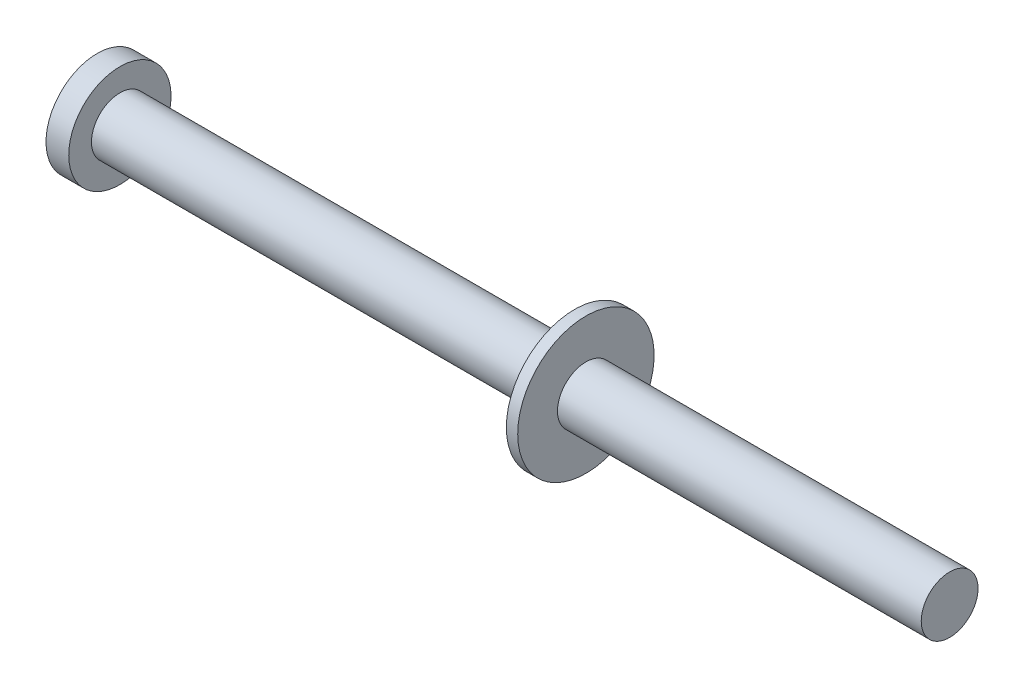
ISO-10303-21;
HEADER;
FILE_DESCRIPTION(('STEP AP214'),'2;1');
FILE_NAME('part.step','',(''),(''),'','','');
FILE_SCHEMA(('AUTOMOTIVE_DESIGN { 1 0 10303 214 1 1 1 1 }'));
ENDSEC;
DATA;
#1=APPLICATION_CONTEXT('core data for automotive mechanical design processes');
#2=APPLICATION_PROTOCOL_DEFINITION('international standard','automotive_design',2000,#1);
#3=PRODUCT_CONTEXT('',#1,'mechanical');
#4=PRODUCT('Part','Part','',(#3));
#5=PRODUCT_RELATED_PRODUCT_CATEGORY('part','',(#4));
#6=PRODUCT_DEFINITION_FORMATION('','',#4);
#7=PRODUCT_DEFINITION_CONTEXT('part definition',#1,'design');
#8=PRODUCT_DEFINITION('design','',#6,#7);
#9=PRODUCT_DEFINITION_SHAPE('','',#8);
#10=(LENGTH_UNIT() NAMED_UNIT(*) SI_UNIT(.MILLI.,.METRE.));
#11=(NAMED_UNIT(*) PLANE_ANGLE_UNIT() SI_UNIT($,.RADIAN.));
#12=(NAMED_UNIT(*) SI_UNIT($,.STERADIAN.) SOLID_ANGLE_UNIT());
#13=UNCERTAINTY_MEASURE_WITH_UNIT(LENGTH_MEASURE(1.E-05),#10,'distance_accuracy_value','');
#14=(GEOMETRIC_REPRESENTATION_CONTEXT(3) GLOBAL_UNCERTAINTY_ASSIGNED_CONTEXT((#13)) GLOBAL_UNIT_ASSIGNED_CONTEXT((#10,
#11,#12)) REPRESENTATION_CONTEXT('',''));
#15=CARTESIAN_POINT('',(0.,0.,0.));
#16=DIRECTION('',(0.,0.,1.));
#17=DIRECTION('',(1.,0.,0.));
#18=AXIS2_PLACEMENT_3D('',#15,#16,#17);
#19=CARTESIAN_POINT('',(-75.,0.,0.));
#20=DIRECTION('',(1.,0.,0.));
#21=DIRECTION('',(0.,0.,-1.));
#22=AXIS2_PLACEMENT_3D('',#19,#20,#21);
#23=PLANE('',#22);
#24=CARTESIAN_POINT('',(-75.,0.,0.));
#25=DIRECTION('',(-1.,0.,0.));
#26=DIRECTION('',(0.,0.,1.));
#27=AXIS2_PLACEMENT_3D('',#24,#25,#26);
#28=CIRCLE('',#27,9.);
#29=CARTESIAN_POINT('',(-75.,0.,9.));
#30=VERTEX_POINT('',#29);
#31=EDGE_CURVE('E10',#30,#30,#28,.T.);
#32=ORIENTED_EDGE('',*,*,#31,.T.);
#33=EDGE_LOOP('',(#32));
#34=FACE_BOUND('',#33,.T.);
#35=ADVANCED_FACE('F31',(#34),#23,.F.);
#36=CARTESIAN_POINT('',(-75.,0.,0.));
#37=DIRECTION('',(-1.,0.,0.));
#38=DIRECTION('',(0.,0.,1.));
#39=AXIS2_PLACEMENT_3D('',#36,#37,#38);
#40=CYLINDRICAL_SURFACE('',#39,9.);
#41=ORIENTED_EDGE('',*,*,#31,.F.);
#42=EDGE_LOOP('',(#41));
#43=FACE_BOUND('',#42,.T.);
#44=CARTESIAN_POINT('',(-71.,0.,0.));
#45=DIRECTION('',(-1.,0.,0.));
#46=DIRECTION('',(0.,0.,1.));
#47=AXIS2_PLACEMENT_3D('',#44,#45,#46);
#48=CIRCLE('',#47,9.);
#49=CARTESIAN_POINT('',(-71.,0.,9.));
#50=VERTEX_POINT('',#49);
#51=EDGE_CURVE('E37',#50,#50,#48,.T.);
#52=ORIENTED_EDGE('',*,*,#51,.T.);
#53=EDGE_LOOP('',(#52));
#54=FACE_BOUND('',#53,.T.);
#55=ADVANCED_FACE('F75',(#43,#54),#40,.T.);
#56=CARTESIAN_POINT('',(-71.,0.,-9.));
#57=DIRECTION('',(-1.,0.,0.));
#58=DIRECTION('',(0.,0.,1.));
#59=AXIS2_PLACEMENT_3D('',#56,#57,#58);
#60=PLANE('',#59);
#61=ORIENTED_EDGE('',*,*,#51,.F.);
#62=EDGE_LOOP('',(#61));
#63=FACE_BOUND('',#62,.T.);
#64=CARTESIAN_POINT('',(-71.,0.,0.));
#65=DIRECTION('',(-1.,0.,0.));
#66=DIRECTION('',(0.,0.,1.));
#67=AXIS2_PLACEMENT_3D('',#64,#65,#66);
#68=CIRCLE('',#67,5.);
#69=CARTESIAN_POINT('',(-71.,0.,5.));
#70=VERTEX_POINT('',#69);
#71=EDGE_CURVE('E41',#70,#70,#68,.T.);
#72=ORIENTED_EDGE('',*,*,#71,.T.);
#73=EDGE_LOOP('',(#72));
#74=FACE_BOUND('',#73,.T.);
#75=ADVANCED_FACE('F79',(#63,#74),#60,.F.);
#76=CARTESIAN_POINT('',(-75.,0.,0.));
#77=DIRECTION('',(-1.,0.,0.));
#78=DIRECTION('',(0.,0.,1.));
#79=AXIS2_PLACEMENT_3D('',#76,#77,#78);
#80=CYLINDRICAL_SURFACE('',#79,4.99999999999999);
#81=ORIENTED_EDGE('',*,*,#71,.F.);
#82=EDGE_LOOP('',(#81));
#83=FACE_BOUND('',#82,.T.);
#84=CARTESIAN_POINT('',(9.00000000000001,0.,0.));
#85=DIRECTION('',(-1.,0.,0.));
#86=DIRECTION('',(0.,0.,1.));
#87=AXIS2_PLACEMENT_3D('',#84,#85,#86);
#88=CIRCLE('',#87,4.99999999999998);
#89=CARTESIAN_POINT('',(9.00000000000001,0.,4.99999999999997));
#90=VERTEX_POINT('',#89);
#91=EDGE_CURVE('E45',#90,#90,#88,.T.);
#92=ORIENTED_EDGE('',*,*,#91,.T.);
#93=EDGE_LOOP('',(#92));
#94=FACE_BOUND('',#93,.T.);
#95=ADVANCED_FACE('F84',(#83,#94),#80,.T.);
#96=CARTESIAN_POINT('',(9.00000000000001,0.,-5.));
#97=DIRECTION('',(1.,0.,0.));
#98=DIRECTION('',(0.,0.,-1.));
#99=AXIS2_PLACEMENT_3D('',#96,#97,#98);
#100=PLANE('',#99);
#101=ORIENTED_EDGE('',*,*,#91,.F.);
#102=EDGE_LOOP('',(#101));
#103=FACE_BOUND('',#102,.T.);
#104=CARTESIAN_POINT('',(9.00000000000001,0.,0.));
#105=DIRECTION('',(-1.,0.,0.));
#106=DIRECTION('',(0.,0.,1.));
#107=AXIS2_PLACEMENT_3D('',#104,#105,#106);
#108=CIRCLE('',#107,12.);
#109=CARTESIAN_POINT('',(9.00000000000001,0.,12.));
#110=VERTEX_POINT('',#109);
#111=EDGE_CURVE('E50',#110,#110,#108,.T.);
#112=ORIENTED_EDGE('',*,*,#111,.T.);
#113=EDGE_LOOP('',(#112));
#114=FACE_BOUND('',#113,.T.);
#115=ADVANCED_FACE('F90',(#103,#114),#100,.F.);
#116=CARTESIAN_POINT('',(-75.,0.,0.));
#117=DIRECTION('',(-1.,0.,0.));
#118=DIRECTION('',(0.,0.,1.));
#119=AXIS2_PLACEMENT_3D('',#116,#117,#118);
#120=CYLINDRICAL_SURFACE('',#119,12.);
#121=ORIENTED_EDGE('',*,*,#111,.F.);
#122=EDGE_LOOP('',(#121));
#123=FACE_BOUND('',#122,.T.);
#124=CARTESIAN_POINT('',(11.,0.,0.));
#125=DIRECTION('',(-1.,0.,0.));
#126=DIRECTION('',(0.,0.,1.));
#127=AXIS2_PLACEMENT_3D('',#124,#125,#126);
#128=CIRCLE('',#127,12.);
#129=CARTESIAN_POINT('',(11.,0.,12.));
#130=VERTEX_POINT('',#129);
#131=EDGE_CURVE('E53',#130,#130,#128,.T.);
#132=ORIENTED_EDGE('',*,*,#131,.T.);
#133=EDGE_LOOP('',(#132));
#134=FACE_BOUND('',#133,.T.);
#135=ADVANCED_FACE('F94',(#123,#134),#120,.T.);
#136=CARTESIAN_POINT('',(11.,0.,-12.));
#137=DIRECTION('',(-1.,0.,0.));
#138=DIRECTION('',(0.,0.,1.));
#139=AXIS2_PLACEMENT_3D('',#136,#137,#138);
#140=PLANE('',#139);
#141=ORIENTED_EDGE('',*,*,#131,.F.);
#142=EDGE_LOOP('',(#141));
#143=FACE_BOUND('',#142,.T.);
#144=CARTESIAN_POINT('',(11.,0.,0.));
#145=DIRECTION('',(-1.,0.,0.));
#146=DIRECTION('',(0.,0.,1.));
#147=AXIS2_PLACEMENT_3D('',#144,#145,#146);
#148=CIRCLE('',#147,4.99999999999998);
#149=CARTESIAN_POINT('',(11.,0.,4.99999999999996));
#150=VERTEX_POINT('',#149);
#151=EDGE_CURVE('E56',#150,#150,#148,.T.);
#152=ORIENTED_EDGE('',*,*,#151,.T.);
#153=EDGE_LOOP('',(#152));
#154=FACE_BOUND('',#153,.T.);
#155=ADVANCED_FACE('F71',(#143,#154),#140,.F.);
#156=CARTESIAN_POINT('',(-75.,0.,0.));
#157=DIRECTION('',(-1.,0.,0.));
#158=DIRECTION('',(0.,0.,1.));
#159=AXIS2_PLACEMENT_3D('',#156,#157,#158);
#160=CYLINDRICAL_SURFACE('',#159,4.99999999999997);
#161=ORIENTED_EDGE('',*,*,#151,.F.);
#162=EDGE_LOOP('',(#161));
#163=FACE_BOUND('',#162,.T.);
#164=CARTESIAN_POINT('',(75.,0.,0.));
#165=DIRECTION('',(-1.,0.,0.));
#166=DIRECTION('',(0.,0.,1.));
#167=AXIS2_PLACEMENT_3D('',#164,#165,#166);
#168=CIRCLE('',#167,4.99999999999997);
#169=CARTESIAN_POINT('',(75.,0.,4.99999999999994));
#170=VERTEX_POINT('',#169);
#171=EDGE_CURVE('E59',#170,#170,#168,.T.);
#172=ORIENTED_EDGE('',*,*,#171,.T.);
#173=EDGE_LOOP('',(#172));
#174=FACE_BOUND('',#173,.T.);
#175=ADVANCED_FACE('F63',(#163,#174),#160,.T.);
#176=CARTESIAN_POINT('',(75.,0.,-4.99999999999999));
#177=DIRECTION('',(-1.,0.,0.));
#178=DIRECTION('',(0.,0.,1.));
#179=AXIS2_PLACEMENT_3D('',#176,#177,#178);
#180=PLANE('',#179);
#181=ORIENTED_EDGE('',*,*,#171,.F.);
#182=EDGE_LOOP('',(#181));
#183=FACE_BOUND('',#182,.T.);
#184=ADVANCED_FACE('F65',(#183),#180,.F.);
#185=CLOSED_SHELL('',(#35,#55,#75,#95,#115,#135,#155,#175,#184));
#186=MANIFOLD_SOLID_BREP('B2',#185);
#187=ADVANCED_BREP_SHAPE_REPRESENTATION('',(#18,#186),#14);
#188=SHAPE_DEFINITION_REPRESENTATION(#9,#187);
ENDSEC;
END-ISO-10303-21;
